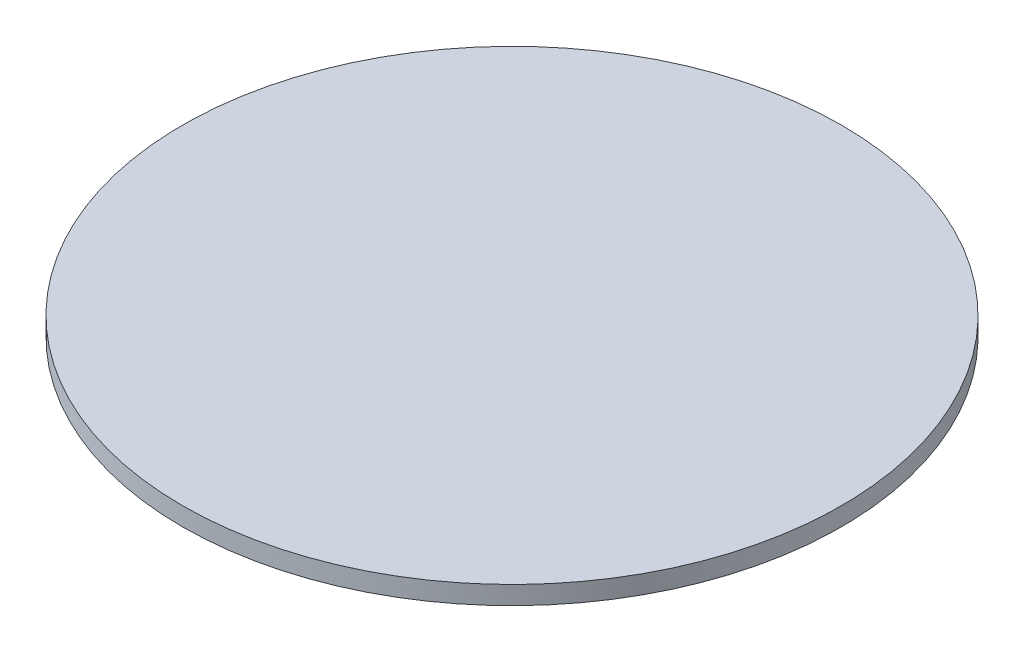
ISO-10303-21;
HEADER;
FILE_DESCRIPTION(('STEP AP214'),'2;1');
FILE_NAME('part.step','',(''),(''),'','','');
FILE_SCHEMA(('AUTOMOTIVE_DESIGN { 1 0 10303 214 1 1 1 1 }'));
ENDSEC;
DATA;
#1=APPLICATION_CONTEXT('core data for automotive mechanical design processes');
#2=APPLICATION_PROTOCOL_DEFINITION('international standard','automotive_design',2000,#1);
#3=PRODUCT_CONTEXT('',#1,'mechanical');
#4=PRODUCT('Part','Part','',(#3));
#5=PRODUCT_RELATED_PRODUCT_CATEGORY('part','',(#4));
#6=PRODUCT_DEFINITION_FORMATION('','',#4);
#7=PRODUCT_DEFINITION_CONTEXT('part definition',#1,'design');
#8=PRODUCT_DEFINITION('design','',#6,#7);
#9=PRODUCT_DEFINITION_SHAPE('','',#8);
#10=(LENGTH_UNIT() NAMED_UNIT(*) SI_UNIT(.MILLI.,.METRE.));
#11=(NAMED_UNIT(*) PLANE_ANGLE_UNIT() SI_UNIT($,.RADIAN.));
#12=(NAMED_UNIT(*) SI_UNIT($,.STERADIAN.) SOLID_ANGLE_UNIT());
#13=UNCERTAINTY_MEASURE_WITH_UNIT(LENGTH_MEASURE(1.E-05),#10,'distance_accuracy_value','');
#14=(GEOMETRIC_REPRESENTATION_CONTEXT(3) GLOBAL_UNCERTAINTY_ASSIGNED_CONTEXT((#13)) GLOBAL_UNIT_ASSIGNED_CONTEXT((#10,
#11,#12)) REPRESENTATION_CONTEXT('',''));
#15=CARTESIAN_POINT('',(0.,0.,0.));
#16=DIRECTION('',(0.,0.,1.));
#17=DIRECTION('',(1.,0.,0.));
#18=AXIS2_PLACEMENT_3D('',#15,#16,#17);
#19=CARTESIAN_POINT('',(0.,1.,0.));
#20=DIRECTION('',(0.,-1.,0.));
#21=DIRECTION('',(0.,0.,-1.));
#22=AXIS2_PLACEMENT_3D('',#19,#20,#21);
#23=CYLINDRICAL_SURFACE('',#22,17.95);
#24=CARTESIAN_POINT('',(0.,1.,0.));
#25=DIRECTION('',(0.,1.,0.));
#26=DIRECTION('',(0.,0.,1.));
#27=AXIS2_PLACEMENT_3D('',#24,#25,#26);
#28=CIRCLE('',#27,17.95);
#29=CARTESIAN_POINT('',(0.,1.,17.95));
#30=VERTEX_POINT('',#29);
#31=EDGE_CURVE('E10',#30,#30,#28,.T.);
#32=ORIENTED_EDGE('',*,*,#31,.F.);
#33=EDGE_LOOP('',(#32));
#34=FACE_BOUND('',#33,.T.);
#35=CARTESIAN_POINT('',(0.,0.,0.));
#36=DIRECTION('',(0.,1.,0.));
#37=DIRECTION('',(0.,0.,1.));
#38=AXIS2_PLACEMENT_3D('',#35,#36,#37);
#39=CIRCLE('',#38,17.95);
#40=CARTESIAN_POINT('',(0.,0.,17.95));
#41=VERTEX_POINT('',#40);
#42=EDGE_CURVE('E42',#41,#41,#39,.T.);
#43=ORIENTED_EDGE('',*,*,#42,.T.);
#44=EDGE_LOOP('',(#43));
#45=FACE_BOUND('',#44,.T.);
#46=ADVANCED_FACE('F39',(#34,#45),#23,.T.);
#47=CARTESIAN_POINT('',(0.,1.,0.));
#48=DIRECTION('',(0.,1.,0.));
#49=DIRECTION('',(0.,0.,1.));
#50=AXIS2_PLACEMENT_3D('',#47,#48,#49);
#51=PLANE('',#50);
#52=ORIENTED_EDGE('',*,*,#31,.T.);
#53=EDGE_LOOP('',(#52));
#54=FACE_BOUND('',#53,.T.);
#55=ADVANCED_FACE('F54',(#54),#51,.T.);
#56=CARTESIAN_POINT('',(0.,0.,0.));
#57=DIRECTION('',(0.,1.,0.));
#58=DIRECTION('',(0.,0.,1.));
#59=AXIS2_PLACEMENT_3D('',#56,#57,#58);
#60=PLANE('',#59);
#61=ORIENTED_EDGE('',*,*,#42,.F.);
#62=EDGE_LOOP('',(#61));
#63=FACE_BOUND('',#62,.T.);
#64=ADVANCED_FACE('F52',(#63),#60,.F.);
#65=CLOSED_SHELL('',(#46,#55,#64));
#66=MANIFOLD_SOLID_BREP('B2',#65);
#67=ADVANCED_BREP_SHAPE_REPRESENTATION('',(#18,#66),#14);
#68=SHAPE_DEFINITION_REPRESENTATION(#9,#67);
ENDSEC;
END-ISO-10303-21;
